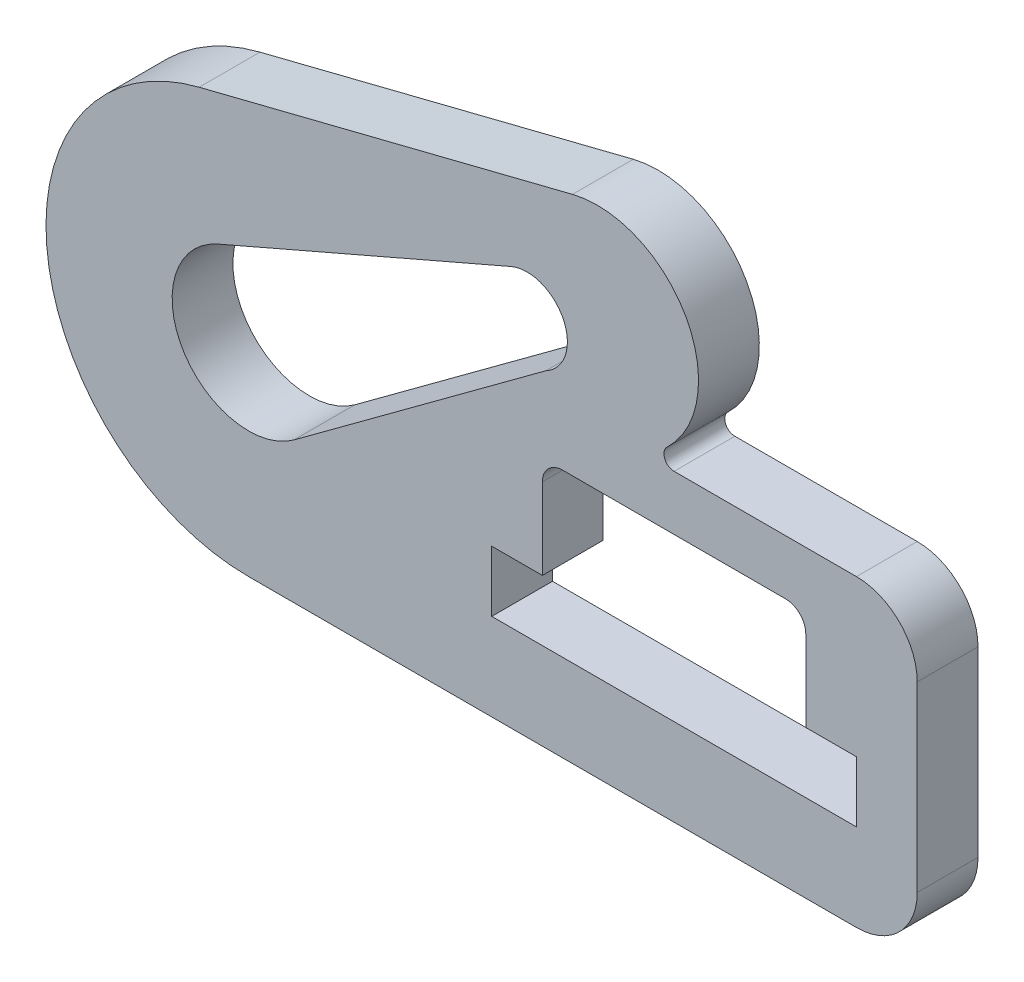
ISO-10303-21;
HEADER;
FILE_DESCRIPTION(('STEP AP214'),'2;1');
FILE_NAME('part.step','',(''),(''),'','','');
FILE_SCHEMA(('AUTOMOTIVE_DESIGN { 1 0 10303 214 1 1 1 1 }'));
ENDSEC;
DATA;
#1=APPLICATION_CONTEXT('core data for automotive mechanical design processes');
#2=APPLICATION_PROTOCOL_DEFINITION('international standard','automotive_design',2000,#1);
#3=PRODUCT_CONTEXT('',#1,'mechanical');
#4=PRODUCT('Part','Part','',(#3));
#5=PRODUCT_RELATED_PRODUCT_CATEGORY('part','',(#4));
#6=PRODUCT_DEFINITION_FORMATION('','',#4);
#7=PRODUCT_DEFINITION_CONTEXT('part definition',#1,'design');
#8=PRODUCT_DEFINITION('design','',#6,#7);
#9=PRODUCT_DEFINITION_SHAPE('','',#8);
#10=(LENGTH_UNIT() NAMED_UNIT(*) SI_UNIT(.MILLI.,.METRE.));
#11=(NAMED_UNIT(*) PLANE_ANGLE_UNIT() SI_UNIT($,.RADIAN.));
#12=(NAMED_UNIT(*) SI_UNIT($,.STERADIAN.) SOLID_ANGLE_UNIT());
#13=UNCERTAINTY_MEASURE_WITH_UNIT(LENGTH_MEASURE(1.E-05),#10,'distance_accuracy_value','');
#14=(GEOMETRIC_REPRESENTATION_CONTEXT(3) GLOBAL_UNCERTAINTY_ASSIGNED_CONTEXT((#13)) GLOBAL_UNIT_ASSIGNED_CONTEXT((#10,
#11,#12)) REPRESENTATION_CONTEXT('',''));
#15=CARTESIAN_POINT('',(0.,0.,0.));
#16=DIRECTION('',(0.,0.,1.));
#17=DIRECTION('',(1.,0.,0.));
#18=AXIS2_PLACEMENT_3D('',#15,#16,#17);
#19=CARTESIAN_POINT('',(0.868741845651793,-0.0330152252978602,0.));
#20=DIRECTION('',(0.,1.,0.));
#21=DIRECTION('',(-1.,0.,0.));
#22=AXIS2_PLACEMENT_3D('',#19,#20,#21);
#23=PLANE('',#22);
#24=DIRECTION('',(-1.,0.,0.));
#25=VECTOR('',#24,1.);
#26=CARTESIAN_POINT('',(0.868741845651793,-0.0330152252978602,0.));
#27=LINE('',#26,#25);
#28=CARTESIAN_POINT('',(-14.6312581543482,-0.0330152252978602,0.));
#29=VERTEX_POINT('',#28);
#30=CARTESIAN_POINT('',(-17.1312581543482,-0.0330152252978624,0.));
#31=VERTEX_POINT('',#30);
#32=EDGE_CURVE('E272',#29,#31,#27,.T.);
#33=ORIENTED_EDGE('',*,*,#32,.F.);
#34=DIRECTION('',(0.,0.,1.));
#35=VECTOR('',#34,1.);
#36=CARTESIAN_POINT('',(-14.6312581543482,-0.0330152252978602,0.));
#37=LINE('',#36,#35);
#38=CARTESIAN_POINT('',(-14.6312581543482,-0.0330152252978602,3.));
#39=VERTEX_POINT('',#38);
#40=EDGE_CURVE('E255',#29,#39,#37,.T.);
#41=ORIENTED_EDGE('',*,*,#40,.T.);
#42=DIRECTION('',(-1.,0.,0.));
#43=VECTOR('',#42,1.);
#44=CARTESIAN_POINT('',(0.868741845651793,-0.0330152252978602,3.));
#45=LINE('',#44,#43);
#46=CARTESIAN_POINT('',(-17.1312581543482,-0.0330152252978624,3.));
#47=VERTEX_POINT('',#46);
#48=EDGE_CURVE('E287',#39,#47,#45,.T.);
#49=ORIENTED_EDGE('',*,*,#48,.T.);
#50=DIRECTION('',(0.,0.,1.));
#51=VECTOR('',#50,1.);
#52=CARTESIAN_POINT('',(-17.1312581543482,-0.0330152252978624,0.));
#53=LINE('',#52,#51);
#54=EDGE_CURVE('E306',#31,#47,#53,.T.);
#55=ORIENTED_EDGE('',*,*,#54,.F.);
#56=EDGE_LOOP('',(#33,#41,#49,#55));
#57=FACE_BOUND('',#56,.T.);
#58=ADVANCED_FACE('F45',(#57),#23,.F.);
#59=CARTESIAN_POINT('',(0.868741845651791,4.66698477470214,3.));
#60=DIRECTION('',(0.,0.,-1.));
#61=DIRECTION('',(-1.,0.,0.));
#62=AXIS2_PLACEMENT_3D('',#59,#60,#61);
#63=CYLINDRICAL_SURFACE('',#62,3.);
#64=CARTESIAN_POINT('',(0.868741845651791,4.66698477470214,0.));
#65=DIRECTION('',(0.,0.,1.));
#66=DIRECTION('',(-1.,0.,0.));
#67=AXIS2_PLACEMENT_3D('',#64,#65,#66);
#68=CIRCLE('',#67,3.);
#69=CARTESIAN_POINT('',(3.86874184565179,4.66698477470214,0.));
#70=VERTEX_POINT('',#69);
#71=CARTESIAN_POINT('',(0.868741845651791,7.66698477470214,0.));
#72=VERTEX_POINT('',#71);
#73=EDGE_CURVE('E346',#70,#72,#68,.T.);
#74=ORIENTED_EDGE('',*,*,#73,.T.);
#75=DIRECTION('',(0.,0.,-1.));
#76=VECTOR('',#75,1.);
#77=CARTESIAN_POINT('',(0.868741845651791,7.66698477470214,3.));
#78=LINE('',#77,#76);
#79=CARTESIAN_POINT('',(0.868741845651791,7.66698477470214,3.));
#80=VERTEX_POINT('',#79);
#81=EDGE_CURVE('E11',#80,#72,#78,.T.);
#82=ORIENTED_EDGE('',*,*,#81,.F.);
#83=CARTESIAN_POINT('',(0.868741845651791,4.66698477470214,3.));
#84=DIRECTION('',(0.,0.,1.));
#85=DIRECTION('',(-1.,0.,0.));
#86=AXIS2_PLACEMENT_3D('',#83,#84,#85);
#87=CIRCLE('',#86,3.);
#88=CARTESIAN_POINT('',(3.86874184565179,4.66698477470214,3.));
#89=VERTEX_POINT('',#88);
#90=EDGE_CURVE('E356',#89,#80,#87,.T.);
#91=ORIENTED_EDGE('',*,*,#90,.F.);
#92=DIRECTION('',(0.,0.,-1.));
#93=VECTOR('',#92,1.);
#94=CARTESIAN_POINT('',(3.86874184565179,4.66698477470214,3.));
#95=LINE('',#94,#93);
#96=EDGE_CURVE('E385',#89,#70,#95,.T.);
#97=ORIENTED_EDGE('',*,*,#96,.T.);
#98=EDGE_LOOP('',(#74,#82,#91,#97));
#99=FACE_BOUND('',#98,.T.);
#100=ADVANCED_FACE('F47',(#99),#63,.T.);
#101=CARTESIAN_POINT('',(-8.13125815434821,7.66698477470214,3.));
#102=DIRECTION('',(0.,-1.,0.));
#103=DIRECTION('',(0.,0.,-1.));
#104=AXIS2_PLACEMENT_3D('',#101,#102,#103);
#105=PLANE('',#104);
#106=DIRECTION('',(-1.,0.,0.));
#107=VECTOR('',#106,1.);
#108=CARTESIAN_POINT('',(-8.13125815434821,7.66698477470214,0.));
#109=LINE('',#108,#107);
#110=CARTESIAN_POINT('',(-8.13125815434821,7.66698477470214,0.));
#111=VERTEX_POINT('',#110);
#112=EDGE_CURVE('E389',#72,#111,#109,.T.);
#113=ORIENTED_EDGE('',*,*,#112,.T.);
#114=DIRECTION('',(0.,0.,-1.));
#115=VECTOR('',#114,1.);
#116=CARTESIAN_POINT('',(-8.13125815434821,7.66698477470214,3.));
#117=LINE('',#116,#115);
#118=CARTESIAN_POINT('',(-8.13125815434821,7.66698477470214,3.));
#119=VERTEX_POINT('',#118);
#120=EDGE_CURVE('E54',#119,#111,#117,.T.);
#121=ORIENTED_EDGE('',*,*,#120,.F.);
#122=DIRECTION('',(-1.,0.,0.));
#123=VECTOR('',#122,1.);
#124=CARTESIAN_POINT('',(-8.13125815434821,7.66698477470214,3.));
#125=LINE('',#124,#123);
#126=EDGE_CURVE('E360',#80,#119,#125,.T.);
#127=ORIENTED_EDGE('',*,*,#126,.F.);
#128=ORIENTED_EDGE('',*,*,#81,.T.);
#129=EDGE_LOOP('',(#113,#121,#127,#128));
#130=FACE_BOUND('',#129,.T.);
#131=ADVANCED_FACE('F466',(#130),#105,.F.);
#132=CARTESIAN_POINT('',(-8.13125815434821,8.16698477470214,3.));
#133=DIRECTION('',(0.,0.,-1.));
#134=DIRECTION('',(-1.,0.,0.));
#135=AXIS2_PLACEMENT_3D('',#132,#133,#134);
#136=CYLINDRICAL_SURFACE('',#135,0.5);
#137=CARTESIAN_POINT('',(-8.13125815434821,8.16698477470214,0.));
#138=DIRECTION('',(0.,0.,-1.));
#139=DIRECTION('',(1.,0.,0.));
#140=AXIS2_PLACEMENT_3D('',#137,#138,#139);
#141=CIRCLE('',#140,0.5);
#142=CARTESIAN_POINT('',(-8.47608574055511,8.52905374021938,0.));
#143=VERTEX_POINT('',#142);
#144=EDGE_CURVE('E392',#111,#143,#141,.T.);
#145=ORIENTED_EDGE('',*,*,#144,.T.);
#146=DIRECTION('',(0.,0.,-1.));
#147=VECTOR('',#146,1.);
#148=CARTESIAN_POINT('',(-8.47608574055511,8.52905374021938,3.));
#149=LINE('',#148,#147);
#150=CARTESIAN_POINT('',(-8.47608574055511,8.52905374021938,3.));
#151=VERTEX_POINT('',#150);
#152=EDGE_CURVE('E435',#151,#143,#149,.T.);
#153=ORIENTED_EDGE('',*,*,#152,.F.);
#154=CARTESIAN_POINT('',(-8.13125815434821,8.16698477470214,3.));
#155=DIRECTION('',(0.,0.,-1.));
#156=DIRECTION('',(1.,0.,0.));
#157=AXIS2_PLACEMENT_3D('',#154,#155,#156);
#158=CIRCLE('',#157,0.5);
#159=EDGE_CURVE('E364',#119,#151,#158,.T.);
#160=ORIENTED_EDGE('',*,*,#159,.F.);
#161=ORIENTED_EDGE('',*,*,#120,.T.);
#162=EDGE_LOOP('',(#145,#153,#160,#161));
#163=FACE_BOUND('',#162,.T.);
#164=ADVANCED_FACE('F444',(#163),#136,.F.);
#165=CARTESIAN_POINT('',(-11.9243616026241,12.1497433953918,3.));
#166=DIRECTION('',(0.,0.,-1.));
#167=DIRECTION('',(-1.,0.,0.));
#168=AXIS2_PLACEMENT_3D('',#165,#166,#167);
#169=CYLINDRICAL_SURFACE('',#168,5.);
#170=CARTESIAN_POINT('',(-11.9243616026241,12.1497433953918,0.));
#171=DIRECTION('',(0.,0.,1.));
#172=DIRECTION('',(-1.,0.,0.));
#173=AXIS2_PLACEMENT_3D('',#170,#171,#172);
#174=CIRCLE('',#173,5.);
#175=CARTESIAN_POINT('',(-13.1437648543661,16.9987696594618,0.));
#176=VERTEX_POINT('',#175);
#177=EDGE_CURVE('E395',#143,#176,#174,.T.);
#178=ORIENTED_EDGE('',*,*,#177,.T.);
#179=DIRECTION('',(0.,0.,-1.));
#180=VECTOR('',#179,1.);
#181=CARTESIAN_POINT('',(-13.1437648543661,16.9987696594618,3.));
#182=LINE('',#181,#180);
#183=CARTESIAN_POINT('',(-13.1437648543661,16.9987696594618,3.));
#184=VERTEX_POINT('',#183);
#185=EDGE_CURVE('E431',#184,#176,#182,.T.);
#186=ORIENTED_EDGE('',*,*,#185,.F.);
#187=CARTESIAN_POINT('',(-11.9243616026241,12.1497433953918,3.));
#188=DIRECTION('',(0.,0.,1.));
#189=DIRECTION('',(-1.,0.,0.));
#190=AXIS2_PLACEMENT_3D('',#187,#188,#189);
#191=CIRCLE('',#190,5.);
#192=EDGE_CURVE('E367',#151,#184,#191,.T.);
#193=ORIENTED_EDGE('',*,*,#192,.F.);
#194=ORIENTED_EDGE('',*,*,#152,.T.);
#195=EDGE_LOOP('',(#178,#186,#193,#194));
#196=FACE_BOUND('',#195,.T.);
#197=ADVANCED_FACE('F454',(#196),#169,.T.);
#198=CARTESIAN_POINT('',(-31.5700646578322,12.3650373028422,3.));
#199=DIRECTION('',(0.243880650348401,-0.969805252814007,0.));
#200=DIRECTION('',(0.969805252814008,0.243880650348401,0.));
#201=AXIS2_PLACEMENT_3D('',#198,#199,#200);
#202=PLANE('',#201);
#203=DIRECTION('',(-0.969805252814008,-0.243880650348401,0.));
#204=VECTOR('',#203,1.);
#205=CARTESIAN_POINT('',(-31.5700646578322,12.3650373028422,0.));
#206=LINE('',#205,#204);
#207=CARTESIAN_POINT('',(-31.5700646578322,12.3650373028422,0.));
#208=VERTEX_POINT('',#207);
#209=EDGE_CURVE('E398',#176,#208,#206,.T.);
#210=ORIENTED_EDGE('',*,*,#209,.T.);
#211=DIRECTION('',(0.,0.,-1.));
#212=VECTOR('',#211,1.);
#213=CARTESIAN_POINT('',(-31.5700646578322,12.3650373028422,3.));
#214=LINE('',#213,#212);
#215=CARTESIAN_POINT('',(-31.5700646578322,12.3650373028422,3.));
#216=VERTEX_POINT('',#215);
#217=EDGE_CURVE('E427',#216,#208,#214,.T.);
#218=ORIENTED_EDGE('',*,*,#217,.F.);
#219=DIRECTION('',(-0.969805252814008,-0.243880650348401,0.));
#220=VECTOR('',#219,1.);
#221=CARTESIAN_POINT('',(-31.5700646578322,12.3650373028422,3.));
#222=LINE('',#221,#220);
#223=EDGE_CURVE('E370',#184,#216,#222,.T.);
#224=ORIENTED_EDGE('',*,*,#223,.F.);
#225=ORIENTED_EDGE('',*,*,#185,.T.);
#226=EDGE_LOOP('',(#210,#218,#224,#225));
#227=FACE_BOUND('',#226,.T.);
#228=ADVANCED_FACE('F458',(#227),#202,.F.);
#229=CARTESIAN_POINT('',(-29.1312581543482,2.66698477470214,3.));
#230=DIRECTION('',(0.,0.,-1.));
#231=DIRECTION('',(-1.,0.,0.));
#232=AXIS2_PLACEMENT_3D('',#229,#230,#231);
#233=CYLINDRICAL_SURFACE('',#232,10.);
#234=CARTESIAN_POINT('',(-29.1312581543482,2.66698477470214,0.));
#235=DIRECTION('',(0.,0.,1.));
#236=DIRECTION('',(1.,0.,0.));
#237=AXIS2_PLACEMENT_3D('',#234,#235,#236);
#238=CIRCLE('',#237,10.);
#239=CARTESIAN_POINT('',(-29.1312581543482,-7.33301522529786,0.));
#240=VERTEX_POINT('',#239);
#241=EDGE_CURVE('E401',#208,#240,#238,.T.);
#242=ORIENTED_EDGE('',*,*,#241,.T.);
#243=DIRECTION('',(0.,0.,-1.));
#244=VECTOR('',#243,1.);
#245=CARTESIAN_POINT('',(-29.1312581543482,-7.33301522529786,3.));
#246=LINE('',#245,#244);
#247=CARTESIAN_POINT('',(-29.1312581543482,-7.33301522529786,3.));
#248=VERTEX_POINT('',#247);
#249=EDGE_CURVE('E423',#248,#240,#246,.T.);
#250=ORIENTED_EDGE('',*,*,#249,.F.);
#251=CARTESIAN_POINT('',(-29.1312581543482,2.66698477470214,3.));
#252=DIRECTION('',(0.,0.,1.));
#253=DIRECTION('',(1.,0.,0.));
#254=AXIS2_PLACEMENT_3D('',#251,#252,#253);
#255=CIRCLE('',#254,10.);
#256=EDGE_CURVE('E373',#216,#248,#255,.T.);
#257=ORIENTED_EDGE('',*,*,#256,.F.);
#258=ORIENTED_EDGE('',*,*,#217,.T.);
#259=EDGE_LOOP('',(#242,#250,#257,#258));
#260=FACE_BOUND('',#259,.T.);
#261=ADVANCED_FACE('F484',(#260),#233,.T.);
#262=CARTESIAN_POINT('',(0.868741845651792,-7.33301522529786,3.));
#263=DIRECTION('',(0.,1.,0.));
#264=DIRECTION('',(-1.,0.,0.));
#265=AXIS2_PLACEMENT_3D('',#262,#263,#264);
#266=PLANE('',#265);
#267=DIRECTION('',(1.,0.,0.));
#268=VECTOR('',#267,1.);
#269=CARTESIAN_POINT('',(0.868741845651792,-7.33301522529786,0.));
#270=LINE('',#269,#268);
#271=CARTESIAN_POINT('',(0.868741845651792,-7.33301522529786,0.));
#272=VERTEX_POINT('',#271);
#273=EDGE_CURVE('E404',#240,#272,#270,.T.);
#274=ORIENTED_EDGE('',*,*,#273,.T.);
#275=DIRECTION('',(0.,0.,-1.));
#276=VECTOR('',#275,1.);
#277=CARTESIAN_POINT('',(0.868741845651792,-7.33301522529786,3.));
#278=LINE('',#277,#276);
#279=CARTESIAN_POINT('',(0.868741845651792,-7.33301522529786,3.));
#280=VERTEX_POINT('',#279);
#281=EDGE_CURVE('E419',#280,#272,#278,.T.);
#282=ORIENTED_EDGE('',*,*,#281,.F.);
#283=DIRECTION('',(1.,0.,0.));
#284=VECTOR('',#283,1.);
#285=CARTESIAN_POINT('',(0.868741845651792,-7.33301522529786,3.));
#286=LINE('',#285,#284);
#287=EDGE_CURVE('E376',#248,#280,#286,.T.);
#288=ORIENTED_EDGE('',*,*,#287,.F.);
#289=ORIENTED_EDGE('',*,*,#249,.T.);
#290=EDGE_LOOP('',(#274,#282,#288,#289));
#291=FACE_BOUND('',#290,.T.);
#292=ADVANCED_FACE('F482',(#291),#266,.F.);
#293=CARTESIAN_POINT('',(0.868741845651792,-4.33301522529786,3.));
#294=DIRECTION('',(0.,0.,-1.));
#295=DIRECTION('',(-1.,0.,0.));
#296=AXIS2_PLACEMENT_3D('',#293,#294,#295);
#297=CYLINDRICAL_SURFACE('',#296,3.);
#298=CARTESIAN_POINT('',(0.868741845651792,-4.33301522529786,0.));
#299=DIRECTION('',(0.,0.,1.));
#300=DIRECTION('',(-1.,0.,0.));
#301=AXIS2_PLACEMENT_3D('',#298,#299,#300);
#302=CIRCLE('',#301,3.);
#303=CARTESIAN_POINT('',(3.86874184565179,-4.33301522529786,0.));
#304=VERTEX_POINT('',#303);
#305=EDGE_CURVE('E407',#272,#304,#302,.T.);
#306=ORIENTED_EDGE('',*,*,#305,.T.);
#307=DIRECTION('',(0.,0.,-1.));
#308=VECTOR('',#307,1.);
#309=CARTESIAN_POINT('',(3.86874184565179,-4.33301522529786,3.));
#310=LINE('',#309,#308);
#311=CARTESIAN_POINT('',(3.86874184565179,-4.33301522529786,3.));
#312=VERTEX_POINT('',#311);
#313=EDGE_CURVE('E415',#312,#304,#310,.T.);
#314=ORIENTED_EDGE('',*,*,#313,.F.);
#315=CARTESIAN_POINT('',(0.868741845651792,-4.33301522529786,3.));
#316=DIRECTION('',(0.,0.,1.));
#317=DIRECTION('',(-1.,0.,0.));
#318=AXIS2_PLACEMENT_3D('',#315,#316,#317);
#319=CIRCLE('',#318,3.);
#320=EDGE_CURVE('E379',#280,#312,#319,.T.);
#321=ORIENTED_EDGE('',*,*,#320,.F.);
#322=ORIENTED_EDGE('',*,*,#281,.T.);
#323=EDGE_LOOP('',(#306,#314,#321,#322));
#324=FACE_BOUND('',#323,.T.);
#325=ADVANCED_FACE('F478',(#324),#297,.T.);
#326=CARTESIAN_POINT('',(3.86874184565179,4.66698477470214,3.));
#327=DIRECTION('',(-1.,0.,0.));
#328=DIRECTION('',(0.,-1.,0.));
#329=AXIS2_PLACEMENT_3D('',#326,#327,#328);
#330=PLANE('',#329);
#331=DIRECTION('',(0.,1.,0.));
#332=VECTOR('',#331,1.);
#333=CARTESIAN_POINT('',(3.86874184565179,4.66698477470214,0.));
#334=LINE('',#333,#332);
#335=EDGE_CURVE('E361',#304,#70,#334,.T.);
#336=ORIENTED_EDGE('',*,*,#335,.T.);
#337=ORIENTED_EDGE('',*,*,#96,.F.);
#338=DIRECTION('',(0.,1.,0.));
#339=VECTOR('',#338,1.);
#340=CARTESIAN_POINT('',(3.86874184565179,4.66698477470214,3.));
#341=LINE('',#340,#339);
#342=EDGE_CURVE('E382',#312,#89,#341,.T.);
#343=ORIENTED_EDGE('',*,*,#342,.F.);
#344=ORIENTED_EDGE('',*,*,#313,.T.);
#345=EDGE_LOOP('',(#336,#337,#343,#344));
#346=FACE_BOUND('',#345,.T.);
#347=ADVANCED_FACE('F473',(#346),#330,.F.);
#348=CARTESIAN_POINT('',(0.868741845651791,4.66698477470214,3.));
#349=DIRECTION('',(0.,0.,-1.));
#350=DIRECTION('',(-1.,0.,0.));
#351=AXIS2_PLACEMENT_3D('',#348,#349,#350);
#352=PLANE('',#351);
#353=ORIENTED_EDGE('',*,*,#48,.F.);
#354=DIRECTION('',(0.,-1.,0.));
#355=VECTOR('',#354,1.);
#356=CARTESIAN_POINT('',(-14.6312581543482,-0.0330152252978602,3.));
#357=LINE('',#356,#355);
#358=CARTESIAN_POINT('',(-14.6312581543482,3.96698477470214,3.));
#359=VERTEX_POINT('',#358);
#360=EDGE_CURVE('E228',#359,#39,#357,.T.);
#361=ORIENTED_EDGE('',*,*,#360,.F.);
#362=CARTESIAN_POINT('',(-13.6312581543482,3.96698477470214,3.));
#363=DIRECTION('',(0.,0.,1.));
#364=DIRECTION('',(-1.,0.,0.));
#365=AXIS2_PLACEMENT_3D('',#362,#363,#364);
#366=CIRCLE('',#365,1.);
#367=CARTESIAN_POINT('',(-13.6312581543482,4.96698477470214,3.));
#368=VERTEX_POINT('',#367);
#369=EDGE_CURVE('E231',#368,#359,#366,.T.);
#370=ORIENTED_EDGE('',*,*,#369,.F.);
#371=DIRECTION('',(-1.,0.,0.));
#372=VECTOR('',#371,1.);
#373=CARTESIAN_POINT('',(-13.6312581543482,4.96698477470214,3.));
#374=LINE('',#373,#372);
#375=CARTESIAN_POINT('',(-2.63125815434821,4.96698477470214,3.));
#376=VERTEX_POINT('',#375);
#377=EDGE_CURVE('E248',#376,#368,#374,.T.);
#378=ORIENTED_EDGE('',*,*,#377,.F.);
#379=CARTESIAN_POINT('',(-2.63125815434821,3.96698477470214,3.));
#380=DIRECTION('',(0.,0.,1.));
#381=DIRECTION('',(-1.,0.,0.));
#382=AXIS2_PLACEMENT_3D('',#379,#380,#381);
#383=CIRCLE('',#382,1.);
#384=CARTESIAN_POINT('',(-1.63125815434821,3.96698477470214,3.));
#385=VERTEX_POINT('',#384);
#386=EDGE_CURVE('E245',#385,#376,#383,.T.);
#387=ORIENTED_EDGE('',*,*,#386,.F.);
#388=DIRECTION('',(0.,1.,0.));
#389=VECTOR('',#388,1.);
#390=CARTESIAN_POINT('',(-1.63125815434821,3.96698477470214,3.));
#391=LINE('',#390,#389);
#392=CARTESIAN_POINT('',(-1.63125815434821,-0.0330152252978602,3.));
#393=VERTEX_POINT('',#392);
#394=EDGE_CURVE('E203',#393,#385,#391,.T.);
#395=ORIENTED_EDGE('',*,*,#394,.F.);
#396=CARTESIAN_POINT('',(0.868741845651793,-0.0330152252978602,3.));
#397=VERTEX_POINT('',#396);
#398=EDGE_CURVE('E288',#397,#393,#45,.T.);
#399=ORIENTED_EDGE('',*,*,#398,.F.);
#400=DIRECTION('',(0.,1.,0.));
#401=VECTOR('',#400,1.);
#402=CARTESIAN_POINT('',(0.868741845651793,-0.0330152252978602,3.));
#403=LINE('',#402,#401);
#404=CARTESIAN_POINT('',(0.868741845651793,-3.03301522529786,3.));
#405=VERTEX_POINT('',#404);
#406=EDGE_CURVE('E69',#405,#397,#403,.T.);
#407=ORIENTED_EDGE('',*,*,#406,.F.);
#408=DIRECTION('',(1.,0.,0.));
#409=VECTOR('',#408,1.);
#410=CARTESIAN_POINT('',(0.868741845651793,-3.03301522529786,3.));
#411=LINE('',#410,#409);
#412=CARTESIAN_POINT('',(-17.1312581543482,-3.03301522529786,3.));
#413=VERTEX_POINT('',#412);
#414=EDGE_CURVE('E273',#413,#405,#411,.T.);
#415=ORIENTED_EDGE('',*,*,#414,.F.);
#416=DIRECTION('',(0.,-1.,0.));
#417=VECTOR('',#416,1.);
#418=CARTESIAN_POINT('',(-17.1312581543482,-0.0330152252978624,3.));
#419=LINE('',#418,#417);
#420=EDGE_CURVE('E292',#47,#413,#419,.T.);
#421=ORIENTED_EDGE('',*,*,#420,.F.);
#422=EDGE_LOOP('',(#353,#361,#370,#378,#387,#395,#399,#407,#415,#421));
#423=FACE_BOUND('',#422,.T.);
#424=DIRECTION('',(-0.804731804763463,-0.593638545246297,0.));
#425=VECTOR('',#424,1.);
#426=CARTESIAN_POINT('',(-26.8907715170151,-0.370201522662403,3.));
#427=LINE('',#426,#425);
#428=CARTESIAN_POINT('',(-14.4503506993637,8.80690974935086,3.));
#429=VERTEX_POINT('',#428);
#430=CARTESIAN_POINT('',(-26.8907715170151,-0.370201522662403,3.));
#431=VERTEX_POINT('',#430);
#432=EDGE_CURVE('E325',#429,#431,#427,.T.);
#433=ORIENTED_EDGE('',*,*,#432,.T.);
#434=CARTESIAN_POINT('',(-29.1312581543482,2.66698477470214,3.));
#435=DIRECTION('',(0.,0.,-1.));
#436=DIRECTION('',(1.,0.,0.));
#437=AXIS2_PLACEMENT_3D('',#434,#435,#436);
#438=CIRCLE('',#437,3.7741596385112);
#439=CARTESIAN_POINT('',(-30.632745307218,6.12961633274204,3.));
#440=VERTEX_POINT('',#439);
#441=EDGE_CURVE('E312',#431,#440,#438,.T.);
#442=ORIENTED_EDGE('',*,*,#441,.T.);
#443=DIRECTION('',(0.917457630225151,0.397833503794804,0.));
#444=VECTOR('',#443,1.);
#445=CARTESIAN_POINT('',(-30.632745307218,6.12961633274204,3.));
#446=LINE('',#445,#444);
#447=CARTESIAN_POINT('',(-16.1854580152253,12.3943360694923,3.));
#448=VERTEX_POINT('',#447);
#449=EDGE_CURVE('E316',#440,#448,#446,.T.);
#450=ORIENTED_EDGE('',*,*,#449,.T.);
#451=CARTESIAN_POINT('',(-15.3920969624385,10.5647386513267,3.));
#452=DIRECTION('',(0.,0.,-1.));
#453=DIRECTION('',(-1.,0.,0.));
#454=AXIS2_PLACEMENT_3D('',#451,#452,#453);
#455=CIRCLE('',#454,1.99420371894074);
#456=EDGE_CURVE('E321',#448,#429,#455,.T.);
#457=ORIENTED_EDGE('',*,*,#456,.T.);
#458=EDGE_LOOP('',(#433,#442,#450,#457));
#459=FACE_BOUND('',#458,.T.);
#460=ORIENTED_EDGE('',*,*,#90,.T.);
#461=ORIENTED_EDGE('',*,*,#126,.T.);
#462=ORIENTED_EDGE('',*,*,#159,.T.);
#463=ORIENTED_EDGE('',*,*,#192,.T.);
#464=ORIENTED_EDGE('',*,*,#223,.T.);
#465=ORIENTED_EDGE('',*,*,#256,.T.);
#466=ORIENTED_EDGE('',*,*,#287,.T.);
#467=ORIENTED_EDGE('',*,*,#320,.T.);
#468=ORIENTED_EDGE('',*,*,#342,.T.);
#469=EDGE_LOOP('',(#460,#461,#462,#463,#464,#465,#466,#467,#468));
#470=FACE_BOUND('',#469,.T.);
#471=ADVANCED_FACE('F462',(#423,#459,#470),#352,.F.);
#472=CARTESIAN_POINT('',(0.868741845651791,4.66698477470214,0.));
#473=DIRECTION('',(0.,0.,-1.));
#474=DIRECTION('',(-1.,0.,0.));
#475=AXIS2_PLACEMENT_3D('',#472,#473,#474);
#476=PLANE('',#475);
#477=DIRECTION('',(0.,-1.,0.));
#478=VECTOR('',#477,1.);
#479=CARTESIAN_POINT('',(-14.6312581543482,-0.0330152252978602,0.));
#480=LINE('',#479,#478);
#481=CARTESIAN_POINT('',(-14.6312581543482,3.96698477470214,0.));
#482=VERTEX_POINT('',#481);
#483=EDGE_CURVE('E240',#482,#29,#480,.T.);
#484=ORIENTED_EDGE('',*,*,#483,.T.);
#485=ORIENTED_EDGE('',*,*,#32,.T.);
#486=DIRECTION('',(0.,-1.,0.));
#487=VECTOR('',#486,1.);
#488=CARTESIAN_POINT('',(-17.1312581543482,-0.0330152252978624,0.));
#489=LINE('',#488,#487);
#490=CARTESIAN_POINT('',(-17.1312581543482,-3.03301522529786,0.));
#491=VERTEX_POINT('',#490);
#492=EDGE_CURVE('E276',#31,#491,#489,.T.);
#493=ORIENTED_EDGE('',*,*,#492,.T.);
#494=DIRECTION('',(1.,0.,0.));
#495=VECTOR('',#494,1.);
#496=CARTESIAN_POINT('',(0.868741845651793,-3.03301522529786,0.));
#497=LINE('',#496,#495);
#498=CARTESIAN_POINT('',(0.868741845651793,-3.03301522529786,0.));
#499=VERTEX_POINT('',#498);
#500=EDGE_CURVE('E280',#491,#499,#497,.T.);
#501=ORIENTED_EDGE('',*,*,#500,.T.);
#502=DIRECTION('',(0.,1.,0.));
#503=VECTOR('',#502,1.);
#504=CARTESIAN_POINT('',(0.868741845651793,-0.0330152252978602,0.));
#505=LINE('',#504,#503);
#506=CARTESIAN_POINT('',(0.868741845651793,-0.0330152252978602,0.));
#507=VERTEX_POINT('',#506);
#508=EDGE_CURVE('E269',#499,#507,#505,.T.);
#509=ORIENTED_EDGE('',*,*,#508,.T.);
#510=CARTESIAN_POINT('',(-1.63125815434821,-0.0330152252978605,0.));
#511=VERTEX_POINT('',#510);
#512=EDGE_CURVE('E226',#507,#511,#27,.T.);
#513=ORIENTED_EDGE('',*,*,#512,.T.);
#514=DIRECTION('',(0.,1.,0.));
#515=VECTOR('',#514,1.);
#516=CARTESIAN_POINT('',(-1.63125815434821,3.96698477470214,0.));
#517=LINE('',#516,#515);
#518=CARTESIAN_POINT('',(-1.63125815434821,3.96698477470214,0.));
#519=VERTEX_POINT('',#518);
#520=EDGE_CURVE('E61',#511,#519,#517,.T.);
#521=ORIENTED_EDGE('',*,*,#520,.T.);
#522=CARTESIAN_POINT('',(-2.63125815434821,3.96698477470214,0.));
#523=DIRECTION('',(0.,0.,1.));
#524=DIRECTION('',(-1.,0.,0.));
#525=AXIS2_PLACEMENT_3D('',#522,#523,#524);
#526=CIRCLE('',#525,1.);
#527=CARTESIAN_POINT('',(-2.63125815434821,4.96698477470214,0.));
#528=VERTEX_POINT('',#527);
#529=EDGE_CURVE('E212',#519,#528,#526,.T.);
#530=ORIENTED_EDGE('',*,*,#529,.T.);
#531=DIRECTION('',(-1.,0.,0.));
#532=VECTOR('',#531,1.);
#533=CARTESIAN_POINT('',(-13.6312581543482,4.96698477470214,0.));
#534=LINE('',#533,#532);
#535=CARTESIAN_POINT('',(-13.6312581543482,4.96698477470214,0.));
#536=VERTEX_POINT('',#535);
#537=EDGE_CURVE('E218',#528,#536,#534,.T.);
#538=ORIENTED_EDGE('',*,*,#537,.T.);
#539=CARTESIAN_POINT('',(-13.6312581543482,3.96698477470214,0.));
#540=DIRECTION('',(0.,0.,1.));
#541=DIRECTION('',(-1.,0.,0.));
#542=AXIS2_PLACEMENT_3D('',#539,#540,#541);
#543=CIRCLE('',#542,1.);
#544=EDGE_CURVE('E236',#536,#482,#543,.T.);
#545=ORIENTED_EDGE('',*,*,#544,.T.);
#546=EDGE_LOOP('',(#484,#485,#493,#501,#509,#513,#521,#530,#538,#545));
#547=FACE_BOUND('',#546,.T.);
#548=CARTESIAN_POINT('',(-29.1312581543482,2.66698477470214,0.));
#549=DIRECTION('',(0.,0.,-1.));
#550=DIRECTION('',(1.,0.,0.));
#551=AXIS2_PLACEMENT_3D('',#548,#549,#550);
#552=CIRCLE('',#551,3.7741596385112);
#553=CARTESIAN_POINT('',(-26.8907715170151,-0.370201522662403,0.));
#554=VERTEX_POINT('',#553);
#555=CARTESIAN_POINT('',(-30.632745307218,6.12961633274204,0.));
#556=VERTEX_POINT('',#555);
#557=EDGE_CURVE('E302',#554,#556,#552,.T.);
#558=ORIENTED_EDGE('',*,*,#557,.F.);
#559=DIRECTION('',(-0.804731804763463,-0.593638545246297,0.));
#560=VECTOR('',#559,1.);
#561=CARTESIAN_POINT('',(-26.8907715170151,-0.370201522662403,0.));
#562=LINE('',#561,#560);
#563=CARTESIAN_POINT('',(-14.4503506993637,8.80690974935086,0.));
#564=VERTEX_POINT('',#563);
#565=EDGE_CURVE('E317',#564,#554,#562,.T.);
#566=ORIENTED_EDGE('',*,*,#565,.F.);
#567=CARTESIAN_POINT('',(-15.3920969624385,10.5647386513267,0.));
#568=DIRECTION('',(0.,0.,-1.));
#569=DIRECTION('',(-1.,0.,0.));
#570=AXIS2_PLACEMENT_3D('',#567,#568,#569);
#571=CIRCLE('',#570,1.99420371894074);
#572=CARTESIAN_POINT('',(-16.1854580152253,12.3943360694923,0.));
#573=VERTEX_POINT('',#572);
#574=EDGE_CURVE('E336',#573,#564,#571,.T.);
#575=ORIENTED_EDGE('',*,*,#574,.F.);
#576=DIRECTION('',(0.917457630225151,0.397833503794804,0.));
#577=VECTOR('',#576,1.);
#578=CARTESIAN_POINT('',(-30.632745307218,6.12961633274204,0.));
#579=LINE('',#578,#577);
#580=EDGE_CURVE('E332',#556,#573,#579,.T.);
#581=ORIENTED_EDGE('',*,*,#580,.F.);
#582=EDGE_LOOP('',(#558,#566,#575,#581));
#583=FACE_BOUND('',#582,.T.);
#584=ORIENTED_EDGE('',*,*,#73,.F.);
#585=ORIENTED_EDGE('',*,*,#335,.F.);
#586=ORIENTED_EDGE('',*,*,#305,.F.);
#587=ORIENTED_EDGE('',*,*,#273,.F.);
#588=ORIENTED_EDGE('',*,*,#241,.F.);
#589=ORIENTED_EDGE('',*,*,#209,.F.);
#590=ORIENTED_EDGE('',*,*,#177,.F.);
#591=ORIENTED_EDGE('',*,*,#144,.F.);
#592=ORIENTED_EDGE('',*,*,#112,.F.);
#593=EDGE_LOOP('',(#584,#585,#586,#587,#588,#589,#590,#591,#592));
#594=FACE_BOUND('',#593,.T.);
#595=ADVANCED_FACE('F222',(#547,#583,#594),#476,.T.);
#596=CARTESIAN_POINT('',(-29.1312581543482,2.66698477470214,3.));
#597=DIRECTION('',(0.,0.,-1.));
#598=DIRECTION('',(-1.,0.,0.));
#599=AXIS2_PLACEMENT_3D('',#596,#597,#598);
#600=CYLINDRICAL_SURFACE('',#599,3.7741596385112);
#601=ORIENTED_EDGE('',*,*,#557,.T.);
#602=DIRECTION('',(0.,0.,-1.));
#603=VECTOR('',#602,1.);
#604=CARTESIAN_POINT('',(-30.632745307218,6.12961633274204,3.));
#605=LINE('',#604,#603);
#606=EDGE_CURVE('E329',#440,#556,#605,.T.);
#607=ORIENTED_EDGE('',*,*,#606,.F.);
#608=ORIENTED_EDGE('',*,*,#441,.F.);
#609=DIRECTION('',(0.,0.,-1.));
#610=VECTOR('',#609,1.);
#611=CARTESIAN_POINT('',(-26.8907715170151,-0.370201522662403,3.));
#612=LINE('',#611,#610);
#613=EDGE_CURVE('E343',#431,#554,#612,.T.);
#614=ORIENTED_EDGE('',*,*,#613,.T.);
#615=EDGE_LOOP('',(#601,#607,#608,#614));
#616=FACE_BOUND('',#615,.T.);
#617=ADVANCED_FACE('F554',(#616),#600,.F.);
#618=CARTESIAN_POINT('',(-26.8907715170151,-0.370201522662403,3.));
#619=DIRECTION('',(0.593638545246297,-0.804731804763463,0.));
#620=DIRECTION('',(0.804731804763463,0.593638545246297,0.));
#621=AXIS2_PLACEMENT_3D('',#618,#619,#620);
#622=PLANE('',#621);
#623=ORIENTED_EDGE('',*,*,#565,.T.);
#624=ORIENTED_EDGE('',*,*,#613,.F.);
#625=ORIENTED_EDGE('',*,*,#432,.F.);
#626=DIRECTION('',(0.,0.,-1.));
#627=VECTOR('',#626,1.);
#628=CARTESIAN_POINT('',(-14.4503506993637,8.80690974935086,3.));
#629=LINE('',#628,#627);
#630=EDGE_CURVE('E347',#429,#564,#629,.T.);
#631=ORIENTED_EDGE('',*,*,#630,.T.);
#632=EDGE_LOOP('',(#623,#624,#625,#631));
#633=FACE_BOUND('',#632,.T.);
#634=ADVANCED_FACE('F551',(#633),#622,.F.);
#635=CARTESIAN_POINT('',(-15.3920969624385,10.5647386513267,3.));
#636=DIRECTION('',(0.,0.,-1.));
#637=DIRECTION('',(-1.,0.,0.));
#638=AXIS2_PLACEMENT_3D('',#635,#636,#637);
#639=CYLINDRICAL_SURFACE('',#638,1.99420371894074);
#640=ORIENTED_EDGE('',*,*,#574,.T.);
#641=ORIENTED_EDGE('',*,*,#630,.F.);
#642=ORIENTED_EDGE('',*,*,#456,.F.);
#643=DIRECTION('',(0.,0.,-1.));
#644=VECTOR('',#643,1.);
#645=CARTESIAN_POINT('',(-16.1854580152253,12.3943360694923,3.));
#646=LINE('',#645,#644);
#647=EDGE_CURVE('E350',#448,#573,#646,.T.);
#648=ORIENTED_EDGE('',*,*,#647,.T.);
#649=EDGE_LOOP('',(#640,#641,#642,#648));
#650=FACE_BOUND('',#649,.T.);
#651=ADVANCED_FACE('F547',(#650),#639,.F.);
#652=CARTESIAN_POINT('',(-30.632745307218,6.12961633274204,3.));
#653=DIRECTION('',(-0.397833503794804,0.917457630225151,0.));
#654=DIRECTION('',(-0.917457630225151,-0.397833503794804,0.));
#655=AXIS2_PLACEMENT_3D('',#652,#653,#654);
#656=PLANE('',#655);
#657=ORIENTED_EDGE('',*,*,#580,.T.);
#658=ORIENTED_EDGE('',*,*,#647,.F.);
#659=ORIENTED_EDGE('',*,*,#449,.F.);
#660=ORIENTED_EDGE('',*,*,#606,.T.);
#661=EDGE_LOOP('',(#657,#658,#659,#660));
#662=FACE_BOUND('',#661,.T.);
#663=ADVANCED_FACE('F541',(#662),#656,.F.);
#664=CARTESIAN_POINT('',(0.868741845651793,-0.0330152252978602,0.));
#665=DIRECTION('',(1.,0.,0.));
#666=DIRECTION('',(0.,1.,0.));
#667=AXIS2_PLACEMENT_3D('',#664,#665,#666);
#668=PLANE('',#667);
#669=ORIENTED_EDGE('',*,*,#406,.T.);
#670=DIRECTION('',(0.,0.,1.));
#671=VECTOR('',#670,1.);
#672=CARTESIAN_POINT('',(0.868741845651793,-0.0330152252978602,0.));
#673=LINE('',#672,#671);
#674=EDGE_CURVE('E284',#507,#397,#673,.T.);
#675=ORIENTED_EDGE('',*,*,#674,.F.);
#676=ORIENTED_EDGE('',*,*,#508,.F.);
#677=DIRECTION('',(0.,0.,1.));
#678=VECTOR('',#677,1.);
#679=CARTESIAN_POINT('',(0.868741845651793,-3.03301522529786,0.));
#680=LINE('',#679,#678);
#681=EDGE_CURVE('E299',#499,#405,#680,.T.);
#682=ORIENTED_EDGE('',*,*,#681,.T.);
#683=EDGE_LOOP('',(#669,#675,#676,#682));
#684=FACE_BOUND('',#683,.T.);
#685=ADVANCED_FACE('F539',(#684),#668,.F.);
#686=CARTESIAN_POINT('',(0.868741845651793,-3.03301522529786,0.));
#687=DIRECTION('',(0.,-1.,0.));
#688=DIRECTION('',(1.,0.,0.));
#689=AXIS2_PLACEMENT_3D('',#686,#687,#688);
#690=PLANE('',#689);
#691=ORIENTED_EDGE('',*,*,#414,.T.);
#692=ORIENTED_EDGE('',*,*,#681,.F.);
#693=ORIENTED_EDGE('',*,*,#500,.F.);
#694=DIRECTION('',(0.,0.,1.));
#695=VECTOR('',#694,1.);
#696=CARTESIAN_POINT('',(-17.1312581543482,-3.03301522529786,0.));
#697=LINE('',#696,#695);
#698=EDGE_CURVE('E303',#491,#413,#697,.T.);
#699=ORIENTED_EDGE('',*,*,#698,.T.);
#700=EDGE_LOOP('',(#691,#692,#693,#699));
#701=FACE_BOUND('',#700,.T.);
#702=ADVANCED_FACE('F516',(#701),#690,.F.);
#703=CARTESIAN_POINT('',(-17.1312581543482,-0.0330152252978624,0.));
#704=DIRECTION('',(-1.,0.,0.));
#705=DIRECTION('',(0.,0.,1.));
#706=AXIS2_PLACEMENT_3D('',#703,#704,#705);
#707=PLANE('',#706);
#708=ORIENTED_EDGE('',*,*,#420,.T.);
#709=ORIENTED_EDGE('',*,*,#698,.F.);
#710=ORIENTED_EDGE('',*,*,#492,.F.);
#711=ORIENTED_EDGE('',*,*,#54,.T.);
#712=EDGE_LOOP('',(#708,#709,#710,#711));
#713=FACE_BOUND('',#712,.T.);
#714=ADVANCED_FACE('F507',(#713),#707,.F.);
#715=ORIENTED_EDGE('',*,*,#398,.T.);
#716=DIRECTION('',(0.,0.,1.));
#717=VECTOR('',#716,1.);
#718=CARTESIAN_POINT('',(-1.63125815434821,-0.0330152252978602,0.));
#719=LINE('',#718,#717);
#720=EDGE_CURVE('E209',#511,#393,#719,.T.);
#721=ORIENTED_EDGE('',*,*,#720,.F.);
#722=ORIENTED_EDGE('',*,*,#512,.F.);
#723=ORIENTED_EDGE('',*,*,#674,.T.);
#724=EDGE_LOOP('',(#715,#721,#722,#723));
#725=FACE_BOUND('',#724,.T.);
#726=ADVANCED_FACE('F496',(#725),#23,.F.);
#727=CARTESIAN_POINT('',(-14.6312581543482,-0.0330152252978602,0.));
#728=DIRECTION('',(-1.,0.,0.));
#729=DIRECTION('',(0.,-1.,0.));
#730=AXIS2_PLACEMENT_3D('',#727,#728,#729);
#731=PLANE('',#730);
#732=ORIENTED_EDGE('',*,*,#360,.T.);
#733=ORIENTED_EDGE('',*,*,#40,.F.);
#734=ORIENTED_EDGE('',*,*,#483,.F.);
#735=DIRECTION('',(0.,0.,1.));
#736=VECTOR('',#735,1.);
#737=CARTESIAN_POINT('',(-14.6312581543482,3.96698477470214,0.));
#738=LINE('',#737,#736);
#739=EDGE_CURVE('E259',#482,#359,#738,.T.);
#740=ORIENTED_EDGE('',*,*,#739,.T.);
#741=EDGE_LOOP('',(#732,#733,#734,#740));
#742=FACE_BOUND('',#741,.T.);
#743=ADVANCED_FACE('F506',(#742),#731,.F.);
#744=CARTESIAN_POINT('',(-13.6312581543482,3.96698477470214,0.));
#745=DIRECTION('',(0.,0.,1.));
#746=DIRECTION('',(1.,0.,0.));
#747=AXIS2_PLACEMENT_3D('',#744,#745,#746);
#748=CYLINDRICAL_SURFACE('',#747,1.);
#749=ORIENTED_EDGE('',*,*,#369,.T.);
#750=ORIENTED_EDGE('',*,*,#739,.F.);
#751=ORIENTED_EDGE('',*,*,#544,.F.);
#752=DIRECTION('',(0.,0.,1.));
#753=VECTOR('',#752,1.);
#754=CARTESIAN_POINT('',(-13.6312581543482,4.96698477470214,0.));
#755=LINE('',#754,#753);
#756=EDGE_CURVE('E262',#536,#368,#755,.T.);
#757=ORIENTED_EDGE('',*,*,#756,.T.);
#758=EDGE_LOOP('',(#749,#750,#751,#757));
#759=FACE_BOUND('',#758,.T.);
#760=ADVANCED_FACE('F513',(#759),#748,.F.);
#761=CARTESIAN_POINT('',(-13.6312581543482,4.96698477470214,0.));
#762=DIRECTION('',(0.,1.,0.));
#763=DIRECTION('',(0.,0.,1.));
#764=AXIS2_PLACEMENT_3D('',#761,#762,#763);
#765=PLANE('',#764);
#766=ORIENTED_EDGE('',*,*,#377,.T.);
#767=ORIENTED_EDGE('',*,*,#756,.F.);
#768=ORIENTED_EDGE('',*,*,#537,.F.);
#769=DIRECTION('',(0.,0.,1.));
#770=VECTOR('',#769,1.);
#771=CARTESIAN_POINT('',(-2.63125815434821,4.96698477470214,0.));
#772=LINE('',#771,#770);
#773=EDGE_CURVE('E208',#528,#376,#772,.T.);
#774=ORIENTED_EDGE('',*,*,#773,.T.);
#775=EDGE_LOOP('',(#766,#767,#768,#774));
#776=FACE_BOUND('',#775,.T.);
#777=ADVANCED_FACE('F527',(#776),#765,.F.);
#778=CARTESIAN_POINT('',(-2.63125815434821,3.96698477470214,0.));
#779=DIRECTION('',(0.,0.,1.));
#780=DIRECTION('',(1.,0.,0.));
#781=AXIS2_PLACEMENT_3D('',#778,#779,#780);
#782=CYLINDRICAL_SURFACE('',#781,1.);
#783=ORIENTED_EDGE('',*,*,#386,.T.);
#784=ORIENTED_EDGE('',*,*,#773,.F.);
#785=ORIENTED_EDGE('',*,*,#529,.F.);
#786=DIRECTION('',(0.,0.,1.));
#787=VECTOR('',#786,1.);
#788=CARTESIAN_POINT('',(-1.63125815434821,3.96698477470214,0.));
#789=LINE('',#788,#787);
#790=EDGE_CURVE('E199',#519,#385,#789,.T.);
#791=ORIENTED_EDGE('',*,*,#790,.T.);
#792=EDGE_LOOP('',(#783,#784,#785,#791));
#793=FACE_BOUND('',#792,.T.);
#794=ADVANCED_FACE('F213',(#793),#782,.F.);
#795=CARTESIAN_POINT('',(-1.63125815434821,3.96698477470214,0.));
#796=DIRECTION('',(1.,0.,0.));
#797=DIRECTION('',(0.,1.,0.));
#798=AXIS2_PLACEMENT_3D('',#795,#796,#797);
#799=PLANE('',#798);
#800=ORIENTED_EDGE('',*,*,#394,.T.);
#801=ORIENTED_EDGE('',*,*,#790,.F.);
#802=ORIENTED_EDGE('',*,*,#520,.F.);
#803=ORIENTED_EDGE('',*,*,#720,.T.);
#804=EDGE_LOOP('',(#800,#801,#802,#803));
#805=FACE_BOUND('',#804,.T.);
#806=ADVANCED_FACE('F201',(#805),#799,.F.);
#807=CLOSED_SHELL('',(#58,#100,#131,#164,#197,#228,#261,#292,#325,#347,#471,#595,#617,#634,#651,
#663,#685,#702,#714,#726,#743,#760,#777,#794,#806));
#808=MANIFOLD_SOLID_BREP('B2',#807);
#809=ADVANCED_BREP_SHAPE_REPRESENTATION('',(#18,#808),#14);
#810=SHAPE_DEFINITION_REPRESENTATION(#9,#809);
ENDSEC;
END-ISO-10303-21;
